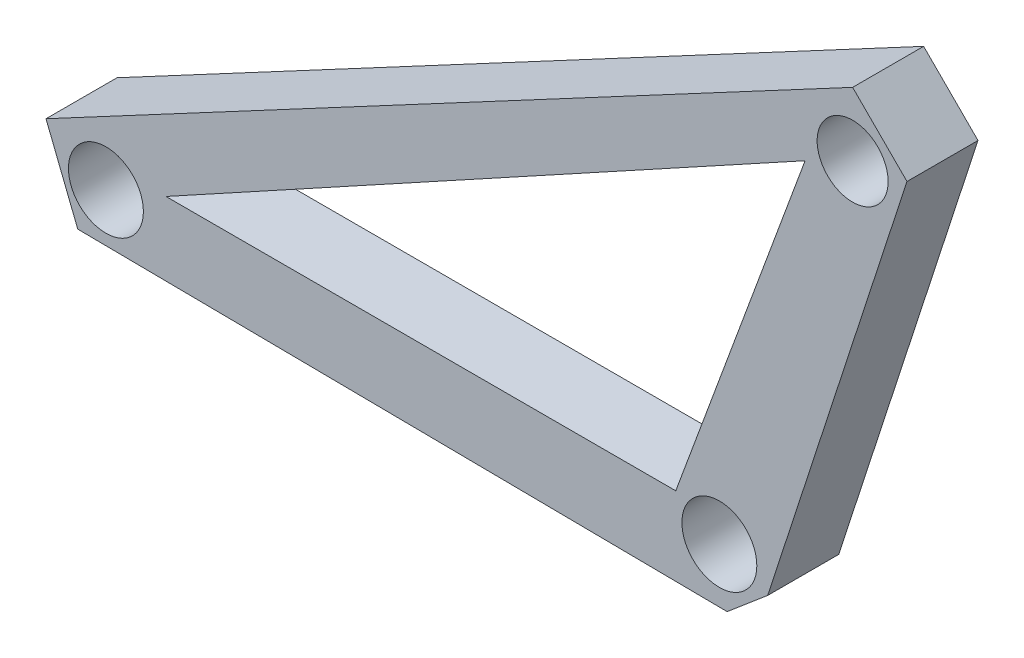
ISO-10303-21;
HEADER;
FILE_DESCRIPTION(('STEP AP214'),'2;1');
FILE_NAME('part.step','',(''),(''),'','','');
FILE_SCHEMA(('AUTOMOTIVE_DESIGN { 1 0 10303 214 1 1 1 1 }'));
ENDSEC;
DATA;
#1=APPLICATION_CONTEXT('core data for automotive mechanical design processes');
#2=APPLICATION_PROTOCOL_DEFINITION('international standard','automotive_design',2000,#1);
#3=PRODUCT_CONTEXT('',#1,'mechanical');
#4=PRODUCT('Part','Part','',(#3));
#5=PRODUCT_RELATED_PRODUCT_CATEGORY('part','',(#4));
#6=PRODUCT_DEFINITION_FORMATION('','',#4);
#7=PRODUCT_DEFINITION_CONTEXT('part definition',#1,'design');
#8=PRODUCT_DEFINITION('design','',#6,#7);
#9=PRODUCT_DEFINITION_SHAPE('','',#8);
#10=(LENGTH_UNIT() NAMED_UNIT(*) SI_UNIT(.MILLI.,.METRE.));
#11=(NAMED_UNIT(*) PLANE_ANGLE_UNIT() SI_UNIT($,.RADIAN.));
#12=(NAMED_UNIT(*) SI_UNIT($,.STERADIAN.) SOLID_ANGLE_UNIT());
#13=UNCERTAINTY_MEASURE_WITH_UNIT(LENGTH_MEASURE(1.E-05),#10,'distance_accuracy_value','');
#14=(GEOMETRIC_REPRESENTATION_CONTEXT(3) GLOBAL_UNCERTAINTY_ASSIGNED_CONTEXT((#13)) GLOBAL_UNIT_ASSIGNED_CONTEXT((#10,
#11,#12)) REPRESENTATION_CONTEXT('',''));
#15=CARTESIAN_POINT('',(0.,0.,0.));
#16=DIRECTION('',(0.,0.,1.));
#17=DIRECTION('',(1.,0.,0.));
#18=AXIS2_PLACEMENT_3D('',#15,#16,#17);
#19=CARTESIAN_POINT('',(0.,0.,10.));
#20=DIRECTION('',(0.,0.,-1.));
#21=DIRECTION('',(-1.,0.,0.));
#22=AXIS2_PLACEMENT_3D('',#19,#20,#21);
#23=PLANE('',#22);
#24=DIRECTION('',(0.763386285369116,0.645942241466172,0.));
#25=VECTOR('',#24,1.);
#26=CARTESIAN_POINT('',(130.543422429706,4.38855215309818,10.));
#27=LINE('',#26,#25);
#28=CARTESIAN_POINT('',(130.543422429706,4.38855215309818,10.));
#29=VERTEX_POINT('',#28);
#30=CARTESIAN_POINT('',(136.251404360206,9.21838301736774,10.));
#31=VERTEX_POINT('',#30);
#32=EDGE_CURVE('E140',#29,#31,#27,.T.);
#33=ORIENTED_EDGE('',*,*,#32,.T.);
#34=DIRECTION('',(0.309414668525764,0.950927212199279,0.));
#35=VECTOR('',#34,1.);
#36=CARTESIAN_POINT('',(155.871075353112,69.515715171796,10.));
#37=LINE('',#36,#35);
#38=CARTESIAN_POINT('',(155.871075353112,69.515715171796,10.));
#39=VERTEX_POINT('',#38);
#40=EDGE_CURVE('E143',#31,#39,#37,.T.);
#41=ORIENTED_EDGE('',*,*,#40,.T.);
#42=DIRECTION('',(-0.707106781186557,0.707106781186539,0.));
#43=VECTOR('',#42,1.);
#44=CARTESIAN_POINT('',(148.216212637602,77.1705778873058,10.));
#45=LINE('',#44,#43);
#46=CARTESIAN_POINT('',(148.216212637602,77.1705778873058,10.));
#47=VERTEX_POINT('',#46);
#48=EDGE_CURVE('E146',#39,#47,#45,.T.);
#49=ORIENTED_EDGE('',*,*,#48,.T.);
#50=DIRECTION('',(-0.88221797659324,-0.470841206539667,0.));
#51=VECTOR('',#50,1.);
#52=CARTESIAN_POINT('',(34.6191859342297,16.5436551409844,10.));
#53=LINE('',#52,#51);
#54=CARTESIAN_POINT('',(34.6191859342297,16.5436551409844,10.));
#55=VERTEX_POINT('',#54);
#56=EDGE_CURVE('E148',#47,#55,#53,.T.);
#57=ORIENTED_EDGE('',*,*,#56,.T.);
#58=DIRECTION('',(0.369972723510368,-0.929042616814924,0.));
#59=VECTOR('',#58,1.);
#60=CARTESIAN_POINT('',(34.6191859342297,16.5436551409844,10.));
#61=LINE('',#60,#59);
#62=CARTESIAN_POINT('',(39.0916638417452,5.3127661732232,10.));
#63=VERTEX_POINT('',#62);
#64=EDGE_CURVE('E150',#55,#63,#61,.T.);
#65=ORIENTED_EDGE('',*,*,#64,.T.);
#66=DIRECTION('',(0.999948938011704,-0.0101055118260044,0.));
#67=VECTOR('',#66,1.);
#68=CARTESIAN_POINT('',(39.0916638417452,5.3127661732232,10.));
#69=LINE('',#68,#67);
#70=EDGE_CURVE('E152',#63,#29,#69,.T.);
#71=ORIENTED_EDGE('',*,*,#70,.T.);
#72=EDGE_LOOP('',(#33,#41,#49,#57,#65,#71));
#73=FACE_BOUND('',#72,.T.);
#74=DIRECTION('',(1.,0.,0.));
#75=VECTOR('',#74,1.);
#76=CARTESIAN_POINT('',(51.5152135848439,15.511098762803,10.));
#77=LINE('',#76,#75);
#78=CARTESIAN_POINT('',(51.5152135848439,15.511098762803,10.));
#79=VERTEX_POINT('',#78);
#80=CARTESIAN_POINT('',(123.306992034147,15.511098762803,10.));
#81=VERTEX_POINT('',#80);
#82=EDGE_CURVE('E110',#79,#81,#77,.T.);
#83=ORIENTED_EDGE('',*,*,#82,.F.);
#84=DIRECTION('',(-0.876802246923695,-0.480851140988102,0.));
#85=VECTOR('',#84,1.);
#86=CARTESIAN_POINT('',(51.5152135848439,15.511098762803,10.));
#87=LINE('',#86,#85);
#88=CARTESIAN_POINT('',(141.520310757591,64.8712068397467,10.));
#89=VERTEX_POINT('',#88);
#90=EDGE_CURVE('E128',#89,#79,#87,.T.);
#91=ORIENTED_EDGE('',*,*,#90,.F.);
#92=DIRECTION('',(0.346174162657366,0.938170266587293,0.));
#93=VECTOR('',#92,1.);
#94=CARTESIAN_POINT('',(141.520310757591,64.8712068397467,10.));
#95=LINE('',#94,#93);
#96=EDGE_CURVE('E118',#81,#89,#95,.T.);
#97=ORIENTED_EDGE('',*,*,#96,.F.);
#98=EDGE_LOOP('',(#83,#91,#97));
#99=FACE_BOUND('',#98,.T.);
#100=CARTESIAN_POINT('',(43.0576224564594,12.0737939684461,10.));
#101=DIRECTION('',(0.,0.,1.));
#102=DIRECTION('',(1.,0.,0.));
#103=AXIS2_PLACEMENT_3D('',#100,#101,#102);
#104=CIRCLE('',#103,5.27673100862124);
#105=CARTESIAN_POINT('',(48.3343534650807,12.0737939684461,10.));
#106=VERTEX_POINT('',#105);
#107=EDGE_CURVE('E134',#106,#106,#104,.T.);
#108=ORIENTED_EDGE('',*,*,#107,.F.);
#109=EDGE_LOOP('',(#108));
#110=FACE_BOUND('',#109,.T.);
#111=CARTESIAN_POINT('',(129.445733596918,12.0737939684461,10.));
#112=DIRECTION('',(0.,0.,1.));
#113=DIRECTION('',(1.,0.,0.));
#114=AXIS2_PLACEMENT_3D('',#111,#112,#113);
#115=CIRCLE('',#114,5.27673100862122);
#116=CARTESIAN_POINT('',(134.722464605539,12.0737939684461,10.));
#117=VERTEX_POINT('',#116);
#118=EDGE_CURVE('E254',#117,#117,#115,.T.);
#119=ORIENTED_EDGE('',*,*,#118,.F.);
#120=EDGE_LOOP('',(#119));
#121=FACE_BOUND('',#120,.T.);
#122=CARTESIAN_POINT('',(148.216212637602,68.1642733381123,10.));
#123=DIRECTION('',(0.,0.,1.));
#124=DIRECTION('',(1.,0.,0.));
#125=AXIS2_PLACEMENT_3D('',#122,#123,#124);
#126=CIRCLE('',#125,5.00000000000002);
#127=CARTESIAN_POINT('',(153.216212637602,68.1642733381123,10.));
#128=VERTEX_POINT('',#127);
#129=EDGE_CURVE('E245',#128,#128,#126,.T.);
#130=ORIENTED_EDGE('',*,*,#129,.F.);
#131=EDGE_LOOP('',(#130));
#132=FACE_BOUND('',#131,.T.);
#133=ADVANCED_FACE('F39',(#73,#99,#110,#121,#132),#23,.F.);
#134=CARTESIAN_POINT('',(0.,0.,0.));
#135=DIRECTION('',(0.,0.,-1.));
#136=DIRECTION('',(-1.,0.,0.));
#137=AXIS2_PLACEMENT_3D('',#134,#135,#136);
#138=PLANE('',#137);
#139=CARTESIAN_POINT('',(129.445733596918,12.0737939684461,0.));
#140=DIRECTION('',(0.,0.,1.));
#141=DIRECTION('',(1.,0.,0.));
#142=AXIS2_PLACEMENT_3D('',#139,#140,#141);
#143=CIRCLE('',#142,5.27673100862122);
#144=CARTESIAN_POINT('',(134.722464605539,12.0737939684461,0.));
#145=VERTEX_POINT('',#144);
#146=EDGE_CURVE('E251',#145,#145,#143,.T.);
#147=ORIENTED_EDGE('',*,*,#146,.T.);
#148=EDGE_LOOP('',(#147));
#149=FACE_BOUND('',#148,.T.);
#150=DIRECTION('',(-0.876802246923695,-0.480851140988102,0.));
#151=VECTOR('',#150,1.);
#152=CARTESIAN_POINT('',(51.5152135848439,15.511098762803,0.));
#153=LINE('',#152,#151);
#154=CARTESIAN_POINT('',(141.520310757591,64.8712068397467,0.));
#155=VERTEX_POINT('',#154);
#156=CARTESIAN_POINT('',(51.5152135848439,15.511098762803,0.));
#157=VERTEX_POINT('',#156);
#158=EDGE_CURVE('E119',#155,#157,#153,.T.);
#159=ORIENTED_EDGE('',*,*,#158,.T.);
#160=DIRECTION('',(1.,0.,0.));
#161=VECTOR('',#160,1.);
#162=CARTESIAN_POINT('',(51.5152135848439,15.511098762803,0.));
#163=LINE('',#162,#161);
#164=CARTESIAN_POINT('',(123.306992034147,15.511098762803,0.));
#165=VERTEX_POINT('',#164);
#166=EDGE_CURVE('E62',#157,#165,#163,.T.);
#167=ORIENTED_EDGE('',*,*,#166,.T.);
#168=DIRECTION('',(0.346174162657366,0.938170266587293,0.));
#169=VECTOR('',#168,1.);
#170=CARTESIAN_POINT('',(141.520310757591,64.8712068397467,0.));
#171=LINE('',#170,#169);
#172=EDGE_CURVE('E124',#165,#155,#171,.T.);
#173=ORIENTED_EDGE('',*,*,#172,.T.);
#174=EDGE_LOOP('',(#159,#167,#173));
#175=FACE_BOUND('',#174,.T.);
#176=DIRECTION('',(0.763386285369116,0.645942241466172,0.));
#177=VECTOR('',#176,1.);
#178=CARTESIAN_POINT('',(130.543422429706,4.38855215309818,0.));
#179=LINE('',#178,#177);
#180=CARTESIAN_POINT('',(130.543422429706,4.38855215309818,0.));
#181=VERTEX_POINT('',#180);
#182=CARTESIAN_POINT('',(136.251404360206,9.21838301736774,0.));
#183=VERTEX_POINT('',#182);
#184=EDGE_CURVE('E125',#181,#183,#179,.T.);
#185=ORIENTED_EDGE('',*,*,#184,.F.);
#186=DIRECTION('',(0.999948938011704,-0.0101055118260044,0.));
#187=VECTOR('',#186,1.);
#188=CARTESIAN_POINT('',(39.0916638417452,5.3127661732232,0.));
#189=LINE('',#188,#187);
#190=CARTESIAN_POINT('',(39.0916638417452,5.3127661732232,0.));
#191=VERTEX_POINT('',#190);
#192=EDGE_CURVE('E144',#191,#181,#189,.T.);
#193=ORIENTED_EDGE('',*,*,#192,.F.);
#194=DIRECTION('',(0.369972723510368,-0.929042616814924,0.));
#195=VECTOR('',#194,1.);
#196=CARTESIAN_POINT('',(34.6191859342297,16.5436551409844,0.));
#197=LINE('',#196,#195);
#198=CARTESIAN_POINT('',(34.6191859342297,16.5436551409844,0.));
#199=VERTEX_POINT('',#198);
#200=EDGE_CURVE('E163',#199,#191,#197,.T.);
#201=ORIENTED_EDGE('',*,*,#200,.F.);
#202=DIRECTION('',(-0.88221797659324,-0.470841206539667,0.));
#203=VECTOR('',#202,1.);
#204=CARTESIAN_POINT('',(34.6191859342297,16.5436551409844,0.));
#205=LINE('',#204,#203);
#206=CARTESIAN_POINT('',(148.216212637602,77.1705778873058,0.));
#207=VERTEX_POINT('',#206);
#208=EDGE_CURVE('E161',#207,#199,#205,.T.);
#209=ORIENTED_EDGE('',*,*,#208,.F.);
#210=DIRECTION('',(-0.707106781186557,0.707106781186539,0.));
#211=VECTOR('',#210,1.);
#212=CARTESIAN_POINT('',(148.216212637602,77.1705778873058,0.));
#213=LINE('',#212,#211);
#214=CARTESIAN_POINT('',(155.871075353112,69.515715171796,0.));
#215=VERTEX_POINT('',#214);
#216=EDGE_CURVE('E159',#215,#207,#213,.T.);
#217=ORIENTED_EDGE('',*,*,#216,.F.);
#218=DIRECTION('',(0.309414668525764,0.950927212199279,0.));
#219=VECTOR('',#218,1.);
#220=CARTESIAN_POINT('',(155.871075353112,69.515715171796,0.));
#221=LINE('',#220,#219);
#222=EDGE_CURVE('E157',#183,#215,#221,.T.);
#223=ORIENTED_EDGE('',*,*,#222,.F.);
#224=EDGE_LOOP('',(#185,#193,#201,#209,#217,#223));
#225=FACE_BOUND('',#224,.T.);
#226=CARTESIAN_POINT('',(43.0576224564594,12.0737939684461,0.));
#227=DIRECTION('',(0.,0.,1.));
#228=DIRECTION('',(1.,0.,0.));
#229=AXIS2_PLACEMENT_3D('',#226,#227,#228);
#230=CIRCLE('',#229,5.27673100862124);
#231=CARTESIAN_POINT('',(48.3343534650807,12.0737939684461,0.));
#232=VERTEX_POINT('',#231);
#233=EDGE_CURVE('E257',#232,#232,#230,.T.);
#234=ORIENTED_EDGE('',*,*,#233,.T.);
#235=EDGE_LOOP('',(#234));
#236=FACE_BOUND('',#235,.T.);
#237=CARTESIAN_POINT('',(148.216212637602,68.1642733381123,0.));
#238=DIRECTION('',(0.,0.,1.));
#239=DIRECTION('',(1.,0.,0.));
#240=AXIS2_PLACEMENT_3D('',#237,#238,#239);
#241=CIRCLE('',#240,5.00000000000002);
#242=CARTESIAN_POINT('',(153.216212637602,68.1642733381123,0.));
#243=VERTEX_POINT('',#242);
#244=EDGE_CURVE('E248',#243,#243,#241,.T.);
#245=ORIENTED_EDGE('',*,*,#244,.T.);
#246=EDGE_LOOP('',(#245));
#247=FACE_BOUND('',#246,.T.);
#248=ADVANCED_FACE('F187',(#149,#175,#225,#236,#247),#138,.T.);
#249=CARTESIAN_POINT('',(130.543422429706,4.38855215309818,10.));
#250=DIRECTION('',(-0.645942241466172,0.763386285369116,0.));
#251=DIRECTION('',(-0.763386285369116,-0.645942241466172,0.));
#252=AXIS2_PLACEMENT_3D('',#249,#250,#251);
#253=PLANE('',#252);
#254=ORIENTED_EDGE('',*,*,#184,.T.);
#255=DIRECTION('',(0.,0.,-1.));
#256=VECTOR('',#255,1.);
#257=CARTESIAN_POINT('',(136.251404360206,9.21838301736774,10.));
#258=LINE('',#257,#256);
#259=EDGE_CURVE('E11',#31,#183,#258,.T.);
#260=ORIENTED_EDGE('',*,*,#259,.F.);
#261=ORIENTED_EDGE('',*,*,#32,.F.);
#262=DIRECTION('',(0.,0.,-1.));
#263=VECTOR('',#262,1.);
#264=CARTESIAN_POINT('',(130.543422429706,4.38855215309818,10.));
#265=LINE('',#264,#263);
#266=EDGE_CURVE('E154',#29,#181,#265,.T.);
#267=ORIENTED_EDGE('',*,*,#266,.T.);
#268=EDGE_LOOP('',(#254,#260,#261,#267));
#269=FACE_BOUND('',#268,.T.);
#270=ADVANCED_FACE('F41',(#269),#253,.F.);
#271=CARTESIAN_POINT('',(155.871075353112,69.515715171796,10.));
#272=DIRECTION('',(-0.950927212199279,0.309414668525764,0.));
#273=DIRECTION('',(-0.309414668525764,-0.950927212199279,0.));
#274=AXIS2_PLACEMENT_3D('',#271,#272,#273);
#275=PLANE('',#274);
#276=ORIENTED_EDGE('',*,*,#222,.T.);
#277=DIRECTION('',(0.,0.,-1.));
#278=VECTOR('',#277,1.);
#279=CARTESIAN_POINT('',(155.871075353112,69.515715171796,10.));
#280=LINE('',#279,#278);
#281=EDGE_CURVE('E47',#39,#215,#280,.T.);
#282=ORIENTED_EDGE('',*,*,#281,.F.);
#283=ORIENTED_EDGE('',*,*,#40,.F.);
#284=ORIENTED_EDGE('',*,*,#259,.T.);
#285=EDGE_LOOP('',(#276,#282,#283,#284));
#286=FACE_BOUND('',#285,.T.);
#287=ADVANCED_FACE('F204',(#286),#275,.F.);
#288=CARTESIAN_POINT('',(148.216212637602,77.1705778873058,10.));
#289=DIRECTION('',(-0.707106781186539,-0.707106781186557,0.));
#290=DIRECTION('',(0.707106781186557,-0.707106781186539,0.));
#291=AXIS2_PLACEMENT_3D('',#288,#289,#290);
#292=PLANE('',#291);
#293=ORIENTED_EDGE('',*,*,#216,.T.);
#294=DIRECTION('',(0.,0.,-1.));
#295=VECTOR('',#294,1.);
#296=CARTESIAN_POINT('',(148.216212637602,77.1705778873058,10.));
#297=LINE('',#296,#295);
#298=EDGE_CURVE('E174',#47,#207,#297,.T.);
#299=ORIENTED_EDGE('',*,*,#298,.F.);
#300=ORIENTED_EDGE('',*,*,#48,.F.);
#301=ORIENTED_EDGE('',*,*,#281,.T.);
#302=EDGE_LOOP('',(#293,#299,#300,#301));
#303=FACE_BOUND('',#302,.T.);
#304=ADVANCED_FACE('F181',(#303),#292,.F.);
#305=CARTESIAN_POINT('',(34.6191859342297,16.5436551409844,10.));
#306=DIRECTION('',(0.470841206539667,-0.88221797659324,0.));
#307=DIRECTION('',(0.88221797659324,0.470841206539667,0.));
#308=AXIS2_PLACEMENT_3D('',#305,#306,#307);
#309=PLANE('',#308);
#310=ORIENTED_EDGE('',*,*,#208,.T.);
#311=DIRECTION('',(0.,0.,-1.));
#312=VECTOR('',#311,1.);
#313=CARTESIAN_POINT('',(34.6191859342297,16.5436551409844,10.));
#314=LINE('',#313,#312);
#315=EDGE_CURVE('E171',#55,#199,#314,.T.);
#316=ORIENTED_EDGE('',*,*,#315,.F.);
#317=ORIENTED_EDGE('',*,*,#56,.F.);
#318=ORIENTED_EDGE('',*,*,#298,.T.);
#319=EDGE_LOOP('',(#310,#316,#317,#318));
#320=FACE_BOUND('',#319,.T.);
#321=ADVANCED_FACE('F193',(#320),#309,.F.);
#322=CARTESIAN_POINT('',(34.6191859342297,16.5436551409844,10.));
#323=DIRECTION('',(0.929042616814924,0.369972723510368,0.));
#324=DIRECTION('',(-0.369972723510368,0.929042616814924,0.));
#325=AXIS2_PLACEMENT_3D('',#322,#323,#324);
#326=PLANE('',#325);
#327=ORIENTED_EDGE('',*,*,#200,.T.);
#328=DIRECTION('',(0.,0.,-1.));
#329=VECTOR('',#328,1.);
#330=CARTESIAN_POINT('',(39.0916638417452,5.3127661732232,10.));
#331=LINE('',#330,#329);
#332=EDGE_CURVE('E168',#63,#191,#331,.T.);
#333=ORIENTED_EDGE('',*,*,#332,.F.);
#334=ORIENTED_EDGE('',*,*,#64,.F.);
#335=ORIENTED_EDGE('',*,*,#315,.T.);
#336=EDGE_LOOP('',(#327,#333,#334,#335));
#337=FACE_BOUND('',#336,.T.);
#338=ADVANCED_FACE('F197',(#337),#326,.F.);
#339=CARTESIAN_POINT('',(39.0916638417452,5.3127661732232,10.));
#340=DIRECTION('',(0.0101055118260044,0.999948938011704,0.));
#341=DIRECTION('',(-0.999948938011704,0.0101055118260044,0.));
#342=AXIS2_PLACEMENT_3D('',#339,#340,#341);
#343=PLANE('',#342);
#344=ORIENTED_EDGE('',*,*,#192,.T.);
#345=ORIENTED_EDGE('',*,*,#266,.F.);
#346=ORIENTED_EDGE('',*,*,#70,.F.);
#347=ORIENTED_EDGE('',*,*,#332,.T.);
#348=EDGE_LOOP('',(#344,#345,#346,#347));
#349=FACE_BOUND('',#348,.T.);
#350=ADVANCED_FACE('F207',(#349),#343,.F.);
#351=CARTESIAN_POINT('',(51.5152135848439,15.511098762803,10.));
#352=DIRECTION('',(0.,1.,0.));
#353=DIRECTION('',(0.,0.,1.));
#354=AXIS2_PLACEMENT_3D('',#351,#352,#353);
#355=PLANE('',#354);
#356=ORIENTED_EDGE('',*,*,#166,.F.);
#357=DIRECTION('',(0.,0.,-1.));
#358=VECTOR('',#357,1.);
#359=CARTESIAN_POINT('',(51.5152135848439,15.511098762803,10.));
#360=LINE('',#359,#358);
#361=EDGE_CURVE('E114',#79,#157,#360,.T.);
#362=ORIENTED_EDGE('',*,*,#361,.F.);
#363=ORIENTED_EDGE('',*,*,#82,.T.);
#364=DIRECTION('',(0.,0.,-1.));
#365=VECTOR('',#364,1.);
#366=CARTESIAN_POINT('',(123.306992034147,15.511098762803,10.));
#367=LINE('',#366,#365);
#368=EDGE_CURVE('E113',#81,#165,#367,.T.);
#369=ORIENTED_EDGE('',*,*,#368,.T.);
#370=EDGE_LOOP('',(#356,#362,#363,#369));
#371=FACE_BOUND('',#370,.T.);
#372=ADVANCED_FACE('F112',(#371),#355,.T.);
#373=CARTESIAN_POINT('',(141.520310757591,64.8712068397467,10.));
#374=DIRECTION('',(-0.938170266587293,0.346174162657366,0.));
#375=DIRECTION('',(-0.346174162657366,-0.938170266587293,0.));
#376=AXIS2_PLACEMENT_3D('',#373,#374,#375);
#377=PLANE('',#376);
#378=ORIENTED_EDGE('',*,*,#172,.F.);
#379=ORIENTED_EDGE('',*,*,#368,.F.);
#380=ORIENTED_EDGE('',*,*,#96,.T.);
#381=DIRECTION('',(0.,0.,-1.));
#382=VECTOR('',#381,1.);
#383=CARTESIAN_POINT('',(141.520310757591,64.8712068397467,10.));
#384=LINE('',#383,#382);
#385=EDGE_CURVE('E54',#89,#155,#384,.T.);
#386=ORIENTED_EDGE('',*,*,#385,.T.);
#387=EDGE_LOOP('',(#378,#379,#380,#386));
#388=FACE_BOUND('',#387,.T.);
#389=ADVANCED_FACE('F122',(#388),#377,.T.);
#390=CARTESIAN_POINT('',(51.5152135848439,15.511098762803,10.));
#391=DIRECTION('',(0.480851140988102,-0.876802246923695,0.));
#392=DIRECTION('',(0.876802246923695,0.480851140988102,0.));
#393=AXIS2_PLACEMENT_3D('',#390,#391,#392);
#394=PLANE('',#393);
#395=ORIENTED_EDGE('',*,*,#158,.F.);
#396=ORIENTED_EDGE('',*,*,#385,.F.);
#397=ORIENTED_EDGE('',*,*,#90,.T.);
#398=ORIENTED_EDGE('',*,*,#361,.T.);
#399=EDGE_LOOP('',(#395,#396,#397,#398));
#400=FACE_BOUND('',#399,.T.);
#401=ADVANCED_FACE('F226',(#400),#394,.T.);
#402=CARTESIAN_POINT('',(43.0576224564594,12.0737939684461,10.));
#403=DIRECTION('',(0.,0.,-1.));
#404=DIRECTION('',(-1.,0.,0.));
#405=AXIS2_PLACEMENT_3D('',#402,#403,#404);
#406=CYLINDRICAL_SURFACE('',#405,5.27673100862124);
#407=ORIENTED_EDGE('',*,*,#107,.T.);
#408=EDGE_LOOP('',(#407));
#409=FACE_BOUND('',#408,.T.);
#410=ORIENTED_EDGE('',*,*,#233,.F.);
#411=EDGE_LOOP('',(#410));
#412=FACE_BOUND('',#411,.T.);
#413=ADVANCED_FACE('F229',(#409,#412),#406,.F.);
#414=CARTESIAN_POINT('',(129.445733596918,12.0737939684461,10.));
#415=DIRECTION('',(0.,0.,-1.));
#416=DIRECTION('',(-1.,0.,0.));
#417=AXIS2_PLACEMENT_3D('',#414,#415,#416);
#418=CYLINDRICAL_SURFACE('',#417,5.27673100862122);
#419=ORIENTED_EDGE('',*,*,#118,.T.);
#420=EDGE_LOOP('',(#419));
#421=FACE_BOUND('',#420,.T.);
#422=ORIENTED_EDGE('',*,*,#146,.F.);
#423=EDGE_LOOP('',(#422));
#424=FACE_BOUND('',#423,.T.);
#425=ADVANCED_FACE('F232',(#421,#424),#418,.F.);
#426=CARTESIAN_POINT('',(148.216212637602,68.1642733381123,10.));
#427=DIRECTION('',(0.,0.,-1.));
#428=DIRECTION('',(-1.,0.,0.));
#429=AXIS2_PLACEMENT_3D('',#426,#427,#428);
#430=CYLINDRICAL_SURFACE('',#429,5.00000000000002);
#431=ORIENTED_EDGE('',*,*,#129,.T.);
#432=EDGE_LOOP('',(#431));
#433=FACE_BOUND('',#432,.T.);
#434=ORIENTED_EDGE('',*,*,#244,.F.);
#435=EDGE_LOOP('',(#434));
#436=FACE_BOUND('',#435,.T.);
#437=ADVANCED_FACE('F236',(#433,#436),#430,.F.);
#438=CLOSED_SHELL('',(#133,#248,#270,#287,#304,#321,#338,#350,#372,#389,#401,#413,#425,#437));
#439=MANIFOLD_SOLID_BREP('B2',#438);
#440=ADVANCED_BREP_SHAPE_REPRESENTATION('',(#18,#439),#14);
#441=SHAPE_DEFINITION_REPRESENTATION(#9,#440);
ENDSEC;
END-ISO-10303-21;
